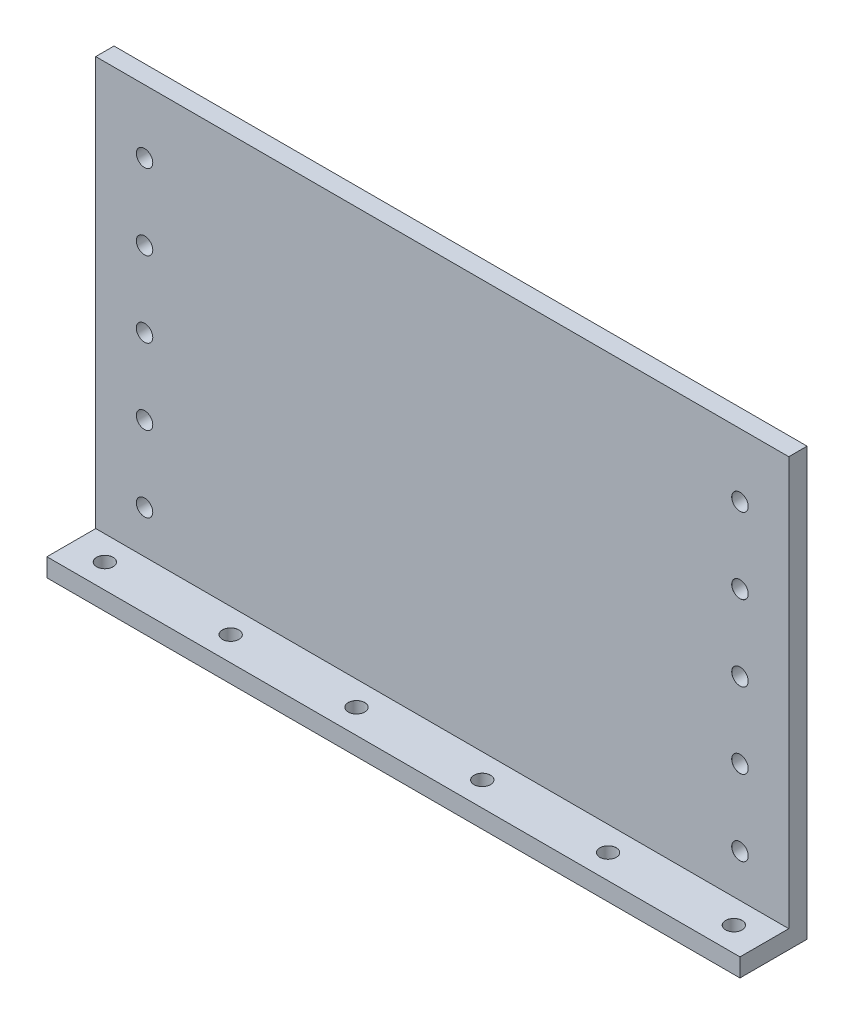
ISO-10303-21;
HEADER;
FILE_DESCRIPTION(('STEP AP214'),'2;1');
FILE_NAME('part.step','',(''),(''),'','','');
FILE_SCHEMA(('AUTOMOTIVE_DESIGN { 1 0 10303 214 1 1 1 1 }'));
ENDSEC;
DATA;
#1=APPLICATION_CONTEXT('core data for automotive mechanical design processes');
#2=APPLICATION_PROTOCOL_DEFINITION('international standard','automotive_design',2000,#1);
#3=PRODUCT_CONTEXT('',#1,'mechanical');
#4=PRODUCT('Part','Part','',(#3));
#5=PRODUCT_RELATED_PRODUCT_CATEGORY('part','',(#4));
#6=PRODUCT_DEFINITION_FORMATION('','',#4);
#7=PRODUCT_DEFINITION_CONTEXT('part definition',#1,'design');
#8=PRODUCT_DEFINITION('design','',#6,#7);
#9=PRODUCT_DEFINITION_SHAPE('','',#8);
#10=(LENGTH_UNIT() NAMED_UNIT(*) SI_UNIT(.MILLI.,.METRE.));
#11=(NAMED_UNIT(*) PLANE_ANGLE_UNIT() SI_UNIT($,.RADIAN.));
#12=(NAMED_UNIT(*) SI_UNIT($,.STERADIAN.) SOLID_ANGLE_UNIT());
#13=UNCERTAINTY_MEASURE_WITH_UNIT(LENGTH_MEASURE(1.E-05),#10,'distance_accuracy_value','');
#14=(GEOMETRIC_REPRESENTATION_CONTEXT(3) GLOBAL_UNCERTAINTY_ASSIGNED_CONTEXT((#13)) GLOBAL_UNIT_ASSIGNED_CONTEXT((#10,
#11,#12)) REPRESENTATION_CONTEXT('',''));
#15=CARTESIAN_POINT('',(0.,0.,0.));
#16=DIRECTION('',(0.,0.,1.));
#17=DIRECTION('',(1.,0.,0.));
#18=AXIS2_PLACEMENT_3D('',#15,#16,#17);
#19=CARTESIAN_POINT('',(-256.5,-160.,35.));
#20=DIRECTION('',(0.,1.,0.));
#21=DIRECTION('',(0.,0.,1.));
#22=AXIS2_PLACEMENT_3D('',#19,#20,#21);
#23=CONICAL_SURFACE('',#22,6.77499999999998,0.872664625996683);
#24=CARTESIAN_POINT('',(-256.5,-160.020977490779,35.));
#25=DIRECTION('',(0.,1.,0.));
#26=DIRECTION('',(0.,0.,1.));
#27=AXIS2_PLACEMENT_3D('',#24,#25,#26);
#28=CIRCLE('',#27,6.74999999999998);
#29=CARTESIAN_POINT('',(-256.5,-160.020977490779,41.75));
#30=VERTEX_POINT('',#29);
#31=EDGE_CURVE('E11',#30,#30,#28,.T.);
#32=ORIENTED_EDGE('',*,*,#31,.F.);
#33=EDGE_LOOP('',(#32));
#34=FACE_BOUND('',#33,.T.);
#35=CARTESIAN_POINT('',(-256.5,-160.,35.));
#36=DIRECTION('',(0.,1.,0.));
#37=DIRECTION('',(0.,0.,1.));
#38=AXIS2_PLACEMENT_3D('',#35,#36,#37);
#39=CIRCLE('',#38,6.77499999999998);
#40=CARTESIAN_POINT('',(-256.5,-160.,41.775));
#41=VERTEX_POINT('',#40);
#42=EDGE_CURVE('E197',#41,#41,#39,.T.);
#43=ORIENTED_EDGE('',*,*,#42,.T.);
#44=EDGE_LOOP('',(#43));
#45=FACE_BOUND('',#44,.T.);
#46=ADVANCED_FACE('F39',(#34,#45),#23,.F.);
#47=CARTESIAN_POINT('',(-256.5,-160.,35.));
#48=DIRECTION('',(0.,1.,0.));
#49=DIRECTION('',(0.,0.,1.));
#50=AXIS2_PLACEMENT_3D('',#47,#48,#49);
#51=CYLINDRICAL_SURFACE('',#50,6.74999999999998);
#52=CARTESIAN_POINT('',(-256.5,-175.,35.));
#53=DIRECTION('',(0.,1.,0.));
#54=DIRECTION('',(0.,0.,1.));
#55=AXIS2_PLACEMENT_3D('',#52,#53,#54);
#56=CIRCLE('',#55,6.74999999999998);
#57=CARTESIAN_POINT('',(-256.5,-175.,41.75));
#58=VERTEX_POINT('',#57);
#59=EDGE_CURVE('E46',#58,#58,#56,.T.);
#60=ORIENTED_EDGE('',*,*,#59,.F.);
#61=EDGE_LOOP('',(#60));
#62=FACE_BOUND('',#61,.T.);
#63=ORIENTED_EDGE('',*,*,#31,.T.);
#64=EDGE_LOOP('',(#63));
#65=FACE_BOUND('',#64,.T.);
#66=ADVANCED_FACE('F204',(#62,#65),#51,.F.);
#67=CARTESIAN_POINT('',(-153.4,-160.,35.));
#68=DIRECTION('',(0.,1.,0.));
#69=DIRECTION('',(0.,0.,1.));
#70=AXIS2_PLACEMENT_3D('',#67,#68,#69);
#71=CONICAL_SURFACE('',#70,6.77499999999998,0.872664625996683);
#72=CARTESIAN_POINT('',(-153.4,-160.020977490779,35.));
#73=DIRECTION('',(0.,1.,0.));
#74=DIRECTION('',(0.,0.,1.));
#75=AXIS2_PLACEMENT_3D('',#72,#73,#74);
#76=CIRCLE('',#75,6.74999999999998);
#77=CARTESIAN_POINT('',(-153.4,-160.020977490779,41.75));
#78=VERTEX_POINT('',#77);
#79=EDGE_CURVE('E194',#78,#78,#76,.T.);
#80=ORIENTED_EDGE('',*,*,#79,.F.);
#81=EDGE_LOOP('',(#80));
#82=FACE_BOUND('',#81,.T.);
#83=CARTESIAN_POINT('',(-153.4,-160.,35.));
#84=DIRECTION('',(0.,1.,0.));
#85=DIRECTION('',(0.,0.,1.));
#86=AXIS2_PLACEMENT_3D('',#83,#84,#85);
#87=CIRCLE('',#86,6.77499999999998);
#88=CARTESIAN_POINT('',(-153.4,-160.,41.775));
#89=VERTEX_POINT('',#88);
#90=EDGE_CURVE('E188',#89,#89,#87,.T.);
#91=ORIENTED_EDGE('',*,*,#90,.T.);
#92=EDGE_LOOP('',(#91));
#93=FACE_BOUND('',#92,.T.);
#94=ADVANCED_FACE('F207',(#82,#93),#71,.F.);
#95=CARTESIAN_POINT('',(-153.4,-160.,35.));
#96=DIRECTION('',(0.,1.,0.));
#97=DIRECTION('',(0.,0.,1.));
#98=AXIS2_PLACEMENT_3D('',#95,#96,#97);
#99=CYLINDRICAL_SURFACE('',#98,6.74999999999998);
#100=CARTESIAN_POINT('',(-153.4,-175.,35.));
#101=DIRECTION('',(0.,1.,0.));
#102=DIRECTION('',(0.,0.,1.));
#103=AXIS2_PLACEMENT_3D('',#100,#101,#102);
#104=CIRCLE('',#103,6.74999999999998);
#105=CARTESIAN_POINT('',(-153.4,-175.,41.75));
#106=VERTEX_POINT('',#105);
#107=EDGE_CURVE('E191',#106,#106,#104,.T.);
#108=ORIENTED_EDGE('',*,*,#107,.F.);
#109=EDGE_LOOP('',(#108));
#110=FACE_BOUND('',#109,.T.);
#111=ORIENTED_EDGE('',*,*,#79,.T.);
#112=EDGE_LOOP('',(#111));
#113=FACE_BOUND('',#112,.T.);
#114=ADVANCED_FACE('F287',(#110,#113),#99,.F.);
#115=CARTESIAN_POINT('',(-50.3,-160.,35.));
#116=DIRECTION('',(0.,1.,0.));
#117=DIRECTION('',(0.,0.,1.));
#118=AXIS2_PLACEMENT_3D('',#115,#116,#117);
#119=CONICAL_SURFACE('',#118,6.77499999999998,0.872664625996683);
#120=CARTESIAN_POINT('',(-50.3,-160.020977490779,35.));
#121=DIRECTION('',(0.,1.,0.));
#122=DIRECTION('',(0.,0.,1.));
#123=AXIS2_PLACEMENT_3D('',#120,#121,#122);
#124=CIRCLE('',#123,6.74999999999998);
#125=CARTESIAN_POINT('',(-50.3,-160.020977490779,41.75));
#126=VERTEX_POINT('',#125);
#127=EDGE_CURVE('E185',#126,#126,#124,.T.);
#128=ORIENTED_EDGE('',*,*,#127,.F.);
#129=EDGE_LOOP('',(#128));
#130=FACE_BOUND('',#129,.T.);
#131=CARTESIAN_POINT('',(-50.3,-160.,35.));
#132=DIRECTION('',(0.,1.,0.));
#133=DIRECTION('',(0.,0.,1.));
#134=AXIS2_PLACEMENT_3D('',#131,#132,#133);
#135=CIRCLE('',#134,6.77499999999998);
#136=CARTESIAN_POINT('',(-50.3,-160.,41.775));
#137=VERTEX_POINT('',#136);
#138=EDGE_CURVE('E179',#137,#137,#135,.T.);
#139=ORIENTED_EDGE('',*,*,#138,.T.);
#140=EDGE_LOOP('',(#139));
#141=FACE_BOUND('',#140,.T.);
#142=ADVANCED_FACE('F283',(#130,#141),#119,.F.);
#143=CARTESIAN_POINT('',(-50.3,-160.,35.));
#144=DIRECTION('',(0.,1.,0.));
#145=DIRECTION('',(0.,0.,1.));
#146=AXIS2_PLACEMENT_3D('',#143,#144,#145);
#147=CYLINDRICAL_SURFACE('',#146,6.74999999999998);
#148=CARTESIAN_POINT('',(-50.3,-175.,35.));
#149=DIRECTION('',(0.,1.,0.));
#150=DIRECTION('',(0.,0.,1.));
#151=AXIS2_PLACEMENT_3D('',#148,#149,#150);
#152=CIRCLE('',#151,6.74999999999998);
#153=CARTESIAN_POINT('',(-50.3,-175.,41.75));
#154=VERTEX_POINT('',#153);
#155=EDGE_CURVE('E182',#154,#154,#152,.T.);
#156=ORIENTED_EDGE('',*,*,#155,.F.);
#157=EDGE_LOOP('',(#156));
#158=FACE_BOUND('',#157,.T.);
#159=ORIENTED_EDGE('',*,*,#127,.T.);
#160=EDGE_LOOP('',(#159));
#161=FACE_BOUND('',#160,.T.);
#162=ADVANCED_FACE('F279',(#158,#161),#147,.F.);
#163=CARTESIAN_POINT('',(52.8000000000001,-160.,35.));
#164=DIRECTION('',(0.,1.,0.));
#165=DIRECTION('',(0.,0.,1.));
#166=AXIS2_PLACEMENT_3D('',#163,#164,#165);
#167=CONICAL_SURFACE('',#166,6.77499999999998,0.872664625996683);
#168=CARTESIAN_POINT('',(52.8000000000001,-160.020977490779,35.));
#169=DIRECTION('',(0.,1.,0.));
#170=DIRECTION('',(0.,0.,1.));
#171=AXIS2_PLACEMENT_3D('',#168,#169,#170);
#172=CIRCLE('',#171,6.74999999999998);
#173=CARTESIAN_POINT('',(52.8000000000001,-160.020977490779,41.75));
#174=VERTEX_POINT('',#173);
#175=EDGE_CURVE('E176',#174,#174,#172,.T.);
#176=ORIENTED_EDGE('',*,*,#175,.F.);
#177=EDGE_LOOP('',(#176));
#178=FACE_BOUND('',#177,.T.);
#179=CARTESIAN_POINT('',(52.8000000000001,-160.,35.));
#180=DIRECTION('',(0.,1.,0.));
#181=DIRECTION('',(0.,0.,1.));
#182=AXIS2_PLACEMENT_3D('',#179,#180,#181);
#183=CIRCLE('',#182,6.77499999999998);
#184=CARTESIAN_POINT('',(52.8000000000001,-160.,41.775));
#185=VERTEX_POINT('',#184);
#186=EDGE_CURVE('E145',#185,#185,#183,.T.);
#187=ORIENTED_EDGE('',*,*,#186,.T.);
#188=EDGE_LOOP('',(#187));
#189=FACE_BOUND('',#188,.T.);
#190=ADVANCED_FACE('F275',(#178,#189),#167,.F.);
#191=CARTESIAN_POINT('',(52.8000000000001,-160.,35.));
#192=DIRECTION('',(0.,1.,0.));
#193=DIRECTION('',(0.,0.,1.));
#194=AXIS2_PLACEMENT_3D('',#191,#192,#193);
#195=CYLINDRICAL_SURFACE('',#194,6.74999999999998);
#196=CARTESIAN_POINT('',(52.8000000000001,-175.,35.));
#197=DIRECTION('',(0.,1.,0.));
#198=DIRECTION('',(0.,0.,1.));
#199=AXIS2_PLACEMENT_3D('',#196,#197,#198);
#200=CIRCLE('',#199,6.74999999999998);
#201=CARTESIAN_POINT('',(52.8000000000001,-175.,41.75));
#202=VERTEX_POINT('',#201);
#203=EDGE_CURVE('E173',#202,#202,#200,.T.);
#204=ORIENTED_EDGE('',*,*,#203,.F.);
#205=EDGE_LOOP('',(#204));
#206=FACE_BOUND('',#205,.T.);
#207=ORIENTED_EDGE('',*,*,#175,.T.);
#208=EDGE_LOOP('',(#207));
#209=FACE_BOUND('',#208,.T.);
#210=ADVANCED_FACE('F271',(#206,#209),#195,.F.);
#211=CARTESIAN_POINT('',(244.,-125.,15.));
#212=DIRECTION('',(0.,0.,1.));
#213=DIRECTION('',(1.,0.,0.));
#214=AXIS2_PLACEMENT_3D('',#211,#212,#213);
#215=CONICAL_SURFACE('',#214,6.775,0.872664625996683);
#216=CARTESIAN_POINT('',(244.,-125.,14.9790225092205));
#217=DIRECTION('',(0.,0.,1.));
#218=DIRECTION('',(1.,0.,0.));
#219=AXIS2_PLACEMENT_3D('',#216,#217,#218);
#220=CIRCLE('',#219,6.75000000000001);
#221=CARTESIAN_POINT('',(250.75,-125.,14.9790225092205));
#222=VERTEX_POINT('',#221);
#223=EDGE_CURVE('E142',#222,#222,#220,.T.);
#224=ORIENTED_EDGE('',*,*,#223,.F.);
#225=EDGE_LOOP('',(#224));
#226=FACE_BOUND('',#225,.T.);
#227=CARTESIAN_POINT('',(244.,-125.,15.));
#228=DIRECTION('',(0.,0.,1.));
#229=DIRECTION('',(1.,0.,0.));
#230=AXIS2_PLACEMENT_3D('',#227,#228,#229);
#231=CIRCLE('',#230,6.775);
#232=CARTESIAN_POINT('',(250.775,-125.,15.));
#233=VERTEX_POINT('',#232);
#234=EDGE_CURVE('E136',#233,#233,#231,.T.);
#235=ORIENTED_EDGE('',*,*,#234,.T.);
#236=EDGE_LOOP('',(#235));
#237=FACE_BOUND('',#236,.T.);
#238=ADVANCED_FACE('F267',(#226,#237),#215,.F.);
#239=CARTESIAN_POINT('',(244.,-125.,15.));
#240=DIRECTION('',(0.,0.,1.));
#241=DIRECTION('',(1.,0.,0.));
#242=AXIS2_PLACEMENT_3D('',#239,#240,#241);
#243=CYLINDRICAL_SURFACE('',#242,6.75000000000001);
#244=CARTESIAN_POINT('',(244.,-125.,0.));
#245=DIRECTION('',(0.,0.,1.));
#246=DIRECTION('',(1.,0.,0.));
#247=AXIS2_PLACEMENT_3D('',#244,#245,#246);
#248=CIRCLE('',#247,6.75000000000001);
#249=CARTESIAN_POINT('',(250.75,-125.,0.));
#250=VERTEX_POINT('',#249);
#251=EDGE_CURVE('E139',#250,#250,#248,.T.);
#252=ORIENTED_EDGE('',*,*,#251,.F.);
#253=EDGE_LOOP('',(#252));
#254=FACE_BOUND('',#253,.T.);
#255=ORIENTED_EDGE('',*,*,#223,.T.);
#256=EDGE_LOOP('',(#255));
#257=FACE_BOUND('',#256,.T.);
#258=ADVANCED_FACE('F263',(#254,#257),#243,.F.);
#259=CARTESIAN_POINT('',(244.,-62.9999999999999,15.));
#260=DIRECTION('',(0.,0.,1.));
#261=DIRECTION('',(1.,0.,0.));
#262=AXIS2_PLACEMENT_3D('',#259,#260,#261);
#263=CONICAL_SURFACE('',#262,6.775,0.872664625996683);
#264=CARTESIAN_POINT('',(244.,-62.9999999999999,14.9790225092205));
#265=DIRECTION('',(0.,0.,1.));
#266=DIRECTION('',(1.,0.,0.));
#267=AXIS2_PLACEMENT_3D('',#264,#265,#266);
#268=CIRCLE('',#267,6.75000000000001);
#269=CARTESIAN_POINT('',(250.75,-62.9999999999999,14.9790225092205));
#270=VERTEX_POINT('',#269);
#271=EDGE_CURVE('E133',#270,#270,#268,.T.);
#272=ORIENTED_EDGE('',*,*,#271,.F.);
#273=EDGE_LOOP('',(#272));
#274=FACE_BOUND('',#273,.T.);
#275=CARTESIAN_POINT('',(244.,-62.9999999999999,15.));
#276=DIRECTION('',(0.,0.,1.));
#277=DIRECTION('',(1.,0.,0.));
#278=AXIS2_PLACEMENT_3D('',#275,#276,#277);
#279=CIRCLE('',#278,6.775);
#280=CARTESIAN_POINT('',(250.775,-62.9999999999999,15.));
#281=VERTEX_POINT('',#280);
#282=EDGE_CURVE('E127',#281,#281,#279,.T.);
#283=ORIENTED_EDGE('',*,*,#282,.T.);
#284=EDGE_LOOP('',(#283));
#285=FACE_BOUND('',#284,.T.);
#286=ADVANCED_FACE('F259',(#274,#285),#263,.F.);
#287=CARTESIAN_POINT('',(244.,-62.9999999999999,15.));
#288=DIRECTION('',(0.,0.,1.));
#289=DIRECTION('',(1.,0.,0.));
#290=AXIS2_PLACEMENT_3D('',#287,#288,#289);
#291=CYLINDRICAL_SURFACE('',#290,6.75000000000001);
#292=CARTESIAN_POINT('',(244.,-62.9999999999999,0.));
#293=DIRECTION('',(0.,0.,1.));
#294=DIRECTION('',(1.,0.,0.));
#295=AXIS2_PLACEMENT_3D('',#292,#293,#294);
#296=CIRCLE('',#295,6.75000000000001);
#297=CARTESIAN_POINT('',(250.75,-62.9999999999999,0.));
#298=VERTEX_POINT('',#297);
#299=EDGE_CURVE('E130',#298,#298,#296,.T.);
#300=ORIENTED_EDGE('',*,*,#299,.F.);
#301=EDGE_LOOP('',(#300));
#302=FACE_BOUND('',#301,.T.);
#303=ORIENTED_EDGE('',*,*,#271,.T.);
#304=EDGE_LOOP('',(#303));
#305=FACE_BOUND('',#304,.T.);
#306=ADVANCED_FACE('F255',(#302,#305),#291,.F.);
#307=CARTESIAN_POINT('',(244.,-0.999999999999945,15.));
#308=DIRECTION('',(0.,0.,1.));
#309=DIRECTION('',(1.,0.,0.));
#310=AXIS2_PLACEMENT_3D('',#307,#308,#309);
#311=CONICAL_SURFACE('',#310,6.775,0.872664625996683);
#312=CARTESIAN_POINT('',(244.,-0.999999999999945,14.9790225092205));
#313=DIRECTION('',(0.,0.,1.));
#314=DIRECTION('',(1.,0.,0.));
#315=AXIS2_PLACEMENT_3D('',#312,#313,#314);
#316=CIRCLE('',#315,6.75000000000001);
#317=CARTESIAN_POINT('',(250.75,-0.999999999999945,14.9790225092205));
#318=VERTEX_POINT('',#317);
#319=EDGE_CURVE('E124',#318,#318,#316,.T.);
#320=ORIENTED_EDGE('',*,*,#319,.F.);
#321=EDGE_LOOP('',(#320));
#322=FACE_BOUND('',#321,.T.);
#323=CARTESIAN_POINT('',(244.,-0.999999999999945,15.));
#324=DIRECTION('',(0.,0.,1.));
#325=DIRECTION('',(1.,0.,0.));
#326=AXIS2_PLACEMENT_3D('',#323,#324,#325);
#327=CIRCLE('',#326,6.775);
#328=CARTESIAN_POINT('',(250.775,-0.999999999999945,15.));
#329=VERTEX_POINT('',#328);
#330=EDGE_CURVE('E118',#329,#329,#327,.T.);
#331=ORIENTED_EDGE('',*,*,#330,.T.);
#332=EDGE_LOOP('',(#331));
#333=FACE_BOUND('',#332,.T.);
#334=ADVANCED_FACE('F251',(#322,#333),#311,.F.);
#335=CARTESIAN_POINT('',(244.,-0.999999999999945,15.));
#336=DIRECTION('',(0.,0.,1.));
#337=DIRECTION('',(1.,0.,0.));
#338=AXIS2_PLACEMENT_3D('',#335,#336,#337);
#339=CYLINDRICAL_SURFACE('',#338,6.75000000000001);
#340=CARTESIAN_POINT('',(244.,-0.999999999999945,0.));
#341=DIRECTION('',(0.,0.,1.));
#342=DIRECTION('',(1.,0.,0.));
#343=AXIS2_PLACEMENT_3D('',#340,#341,#342);
#344=CIRCLE('',#343,6.75000000000001);
#345=CARTESIAN_POINT('',(250.75,-0.999999999999945,0.));
#346=VERTEX_POINT('',#345);
#347=EDGE_CURVE('E121',#346,#346,#344,.T.);
#348=ORIENTED_EDGE('',*,*,#347,.F.);
#349=EDGE_LOOP('',(#348));
#350=FACE_BOUND('',#349,.T.);
#351=ORIENTED_EDGE('',*,*,#319,.T.);
#352=EDGE_LOOP('',(#351));
#353=FACE_BOUND('',#352,.T.);
#354=ADVANCED_FACE('F248',(#350,#353),#339,.F.);
#355=CARTESIAN_POINT('',(-284.,-175.,15.));
#356=DIRECTION('',(1.,0.,0.));
#357=DIRECTION('',(0.,0.,-1.));
#358=AXIS2_PLACEMENT_3D('',#355,#356,#357);
#359=PLANE('',#358);
#360=DIRECTION('',(0.,-1.,0.));
#361=VECTOR('',#360,1.);
#362=CARTESIAN_POINT('',(-284.,-175.,0.));
#363=LINE('',#362,#361);
#364=CARTESIAN_POINT('',(-284.,175.,0.));
#365=VERTEX_POINT('',#364);
#366=CARTESIAN_POINT('',(-284.,-175.,0.));
#367=VERTEX_POINT('',#366);
#368=EDGE_CURVE('E95',#365,#367,#363,.T.);
#369=ORIENTED_EDGE('',*,*,#368,.T.);
#370=DIRECTION('',(0.,0.,-1.));
#371=VECTOR('',#370,1.);
#372=CARTESIAN_POINT('',(-284.,-175.,15.));
#373=LINE('',#372,#371);
#374=CARTESIAN_POINT('',(-284.,-175.,55.));
#375=VERTEX_POINT('',#374);
#376=EDGE_CURVE('E116',#375,#367,#373,.T.);
#377=ORIENTED_EDGE('',*,*,#376,.F.);
#378=DIRECTION('',(0.,-1.,0.));
#379=VECTOR('',#378,1.);
#380=CARTESIAN_POINT('',(-284.,-175.,55.));
#381=LINE('',#380,#379);
#382=CARTESIAN_POINT('',(-284.,-160.,55.));
#383=VERTEX_POINT('',#382);
#384=EDGE_CURVE('E655',#383,#375,#381,.T.);
#385=ORIENTED_EDGE('',*,*,#384,.F.);
#386=DIRECTION('',(0.,0.,-1.));
#387=VECTOR('',#386,1.);
#388=CARTESIAN_POINT('',(-284.,-160.,55.));
#389=LINE('',#388,#387);
#390=CARTESIAN_POINT('',(-284.,-160.,15.));
#391=VERTEX_POINT('',#390);
#392=EDGE_CURVE('E106',#383,#391,#389,.T.);
#393=ORIENTED_EDGE('',*,*,#392,.T.);
#394=DIRECTION('',(0.,-1.,0.));
#395=VECTOR('',#394,1.);
#396=CARTESIAN_POINT('',(-284.,-175.,15.));
#397=LINE('',#396,#395);
#398=CARTESIAN_POINT('',(-284.,175.,15.));
#399=VERTEX_POINT('',#398);
#400=EDGE_CURVE('E88',#399,#391,#397,.T.);
#401=ORIENTED_EDGE('',*,*,#400,.F.);
#402=DIRECTION('',(0.,0.,-1.));
#403=VECTOR('',#402,1.);
#404=CARTESIAN_POINT('',(-284.,175.,15.));
#405=LINE('',#404,#403);
#406=EDGE_CURVE('E81',#399,#365,#405,.T.);
#407=ORIENTED_EDGE('',*,*,#406,.T.);
#408=EDGE_LOOP('',(#369,#377,#385,#393,#401,#407));
#409=FACE_BOUND('',#408,.T.);
#410=ADVANCED_FACE('F93',(#409),#359,.F.);
#411=CARTESIAN_POINT('',(284.,-175.,15.));
#412=DIRECTION('',(0.,1.,0.));
#413=DIRECTION('',(-1.,0.,0.));
#414=AXIS2_PLACEMENT_3D('',#411,#412,#413);
#415=PLANE('',#414);
#416=CARTESIAN_POINT('',(155.9,-175.,35.));
#417=DIRECTION('',(0.,1.,0.));
#418=DIRECTION('',(0.,0.,1.));
#419=AXIS2_PLACEMENT_3D('',#416,#417,#418);
#420=CIRCLE('',#419,6.74999999999998);
#421=CARTESIAN_POINT('',(155.9,-175.,41.75));
#422=VERTEX_POINT('',#421);
#423=EDGE_CURVE('E599',#422,#422,#420,.T.);
#424=ORIENTED_EDGE('',*,*,#423,.T.);
#425=EDGE_LOOP('',(#424));
#426=FACE_BOUND('',#425,.T.);
#427=CARTESIAN_POINT('',(259.,-175.,35.));
#428=DIRECTION('',(0.,1.,0.));
#429=DIRECTION('',(0.,0.,1.));
#430=AXIS2_PLACEMENT_3D('',#427,#428,#429);
#431=CIRCLE('',#430,6.74999999999998);
#432=CARTESIAN_POINT('',(259.,-175.,41.75));
#433=VERTEX_POINT('',#432);
#434=EDGE_CURVE('E614',#433,#433,#431,.T.);
#435=ORIENTED_EDGE('',*,*,#434,.T.);
#436=EDGE_LOOP('',(#435));
#437=FACE_BOUND('',#436,.T.);
#438=DIRECTION('',(1.,0.,0.));
#439=VECTOR('',#438,1.);
#440=CARTESIAN_POINT('',(284.,-175.,0.));
#441=LINE('',#440,#439);
#442=CARTESIAN_POINT('',(284.,-175.,0.));
#443=VERTEX_POINT('',#442);
#444=EDGE_CURVE('E100',#367,#443,#441,.T.);
#445=ORIENTED_EDGE('',*,*,#444,.T.);
#446=DIRECTION('',(0.,0.,-1.));
#447=VECTOR('',#446,1.);
#448=CARTESIAN_POINT('',(284.,-175.,15.));
#449=LINE('',#448,#447);
#450=CARTESIAN_POINT('',(284.,-175.,55.));
#451=VERTEX_POINT('',#450);
#452=EDGE_CURVE('E113',#451,#443,#449,.T.);
#453=ORIENTED_EDGE('',*,*,#452,.F.);
#454=DIRECTION('',(1.,0.,0.));
#455=VECTOR('',#454,1.);
#456=CARTESIAN_POINT('',(-284.,-175.,55.));
#457=LINE('',#456,#455);
#458=EDGE_CURVE('E658',#375,#451,#457,.T.);
#459=ORIENTED_EDGE('',*,*,#458,.F.);
#460=ORIENTED_EDGE('',*,*,#376,.T.);
#461=EDGE_LOOP('',(#445,#453,#459,#460));
#462=FACE_BOUND('',#461,.T.);
#463=ORIENTED_EDGE('',*,*,#203,.T.);
#464=EDGE_LOOP('',(#463));
#465=FACE_BOUND('',#464,.T.);
#466=ORIENTED_EDGE('',*,*,#155,.T.);
#467=EDGE_LOOP('',(#466));
#468=FACE_BOUND('',#467,.T.);
#469=ORIENTED_EDGE('',*,*,#107,.T.);
#470=EDGE_LOOP('',(#469));
#471=FACE_BOUND('',#470,.T.);
#472=ORIENTED_EDGE('',*,*,#59,.T.);
#473=EDGE_LOOP('',(#472));
#474=FACE_BOUND('',#473,.T.);
#475=ADVANCED_FACE('F202',(#426,#437,#462,#465,#468,#471,#474),#415,.F.);
#476=CARTESIAN_POINT('',(284.,-175.,15.));
#477=DIRECTION('',(-1.,0.,0.));
#478=DIRECTION('',(0.,0.,1.));
#479=AXIS2_PLACEMENT_3D('',#476,#477,#478);
#480=PLANE('',#479);
#481=DIRECTION('',(0.,1.,0.));
#482=VECTOR('',#481,1.);
#483=CARTESIAN_POINT('',(284.,-175.,0.));
#484=LINE('',#483,#482);
#485=CARTESIAN_POINT('',(284.,175.,0.));
#486=VERTEX_POINT('',#485);
#487=EDGE_CURVE('E89',#443,#486,#484,.T.);
#488=ORIENTED_EDGE('',*,*,#487,.T.);
#489=DIRECTION('',(0.,0.,-1.));
#490=VECTOR('',#489,1.);
#491=CARTESIAN_POINT('',(284.,175.,15.));
#492=LINE('',#491,#490);
#493=CARTESIAN_POINT('',(284.,175.,15.));
#494=VERTEX_POINT('',#493);
#495=EDGE_CURVE('E84',#494,#486,#492,.T.);
#496=ORIENTED_EDGE('',*,*,#495,.F.);
#497=DIRECTION('',(0.,1.,0.));
#498=VECTOR('',#497,1.);
#499=CARTESIAN_POINT('',(284.,-175.,15.));
#500=LINE('',#499,#498);
#501=CARTESIAN_POINT('',(284.,-160.,15.));
#502=VERTEX_POINT('',#501);
#503=EDGE_CURVE('E669',#502,#494,#500,.T.);
#504=ORIENTED_EDGE('',*,*,#503,.F.);
#505=DIRECTION('',(0.,0.,-1.));
#506=VECTOR('',#505,1.);
#507=CARTESIAN_POINT('',(284.,-160.,55.));
#508=LINE('',#507,#506);
#509=CARTESIAN_POINT('',(284.,-160.,55.));
#510=VERTEX_POINT('',#509);
#511=EDGE_CURVE('E102',#510,#502,#508,.T.);
#512=ORIENTED_EDGE('',*,*,#511,.F.);
#513=DIRECTION('',(0.,1.,0.));
#514=VECTOR('',#513,1.);
#515=CARTESIAN_POINT('',(284.,-175.,55.));
#516=LINE('',#515,#514);
#517=EDGE_CURVE('E661',#451,#510,#516,.T.);
#518=ORIENTED_EDGE('',*,*,#517,.F.);
#519=ORIENTED_EDGE('',*,*,#452,.T.);
#520=EDGE_LOOP('',(#488,#496,#504,#512,#518,#519));
#521=FACE_BOUND('',#520,.T.);
#522=ADVANCED_FACE('F240',(#521),#480,.F.);
#523=CARTESIAN_POINT('',(284.,175.,15.));
#524=DIRECTION('',(0.,-1.,0.));
#525=DIRECTION('',(1.,0.,0.));
#526=AXIS2_PLACEMENT_3D('',#523,#524,#525);
#527=PLANE('',#526);
#528=DIRECTION('',(-1.,0.,0.));
#529=VECTOR('',#528,1.);
#530=CARTESIAN_POINT('',(284.,175.,0.));
#531=LINE('',#530,#529);
#532=EDGE_CURVE('E78',#486,#365,#531,.T.);
#533=ORIENTED_EDGE('',*,*,#532,.T.);
#534=ORIENTED_EDGE('',*,*,#406,.F.);
#535=DIRECTION('',(-1.,0.,0.));
#536=VECTOR('',#535,1.);
#537=CARTESIAN_POINT('',(284.,175.,15.));
#538=LINE('',#537,#536);
#539=EDGE_CURVE('E59',#494,#399,#538,.T.);
#540=ORIENTED_EDGE('',*,*,#539,.F.);
#541=ORIENTED_EDGE('',*,*,#495,.T.);
#542=EDGE_LOOP('',(#533,#534,#540,#541));
#543=FACE_BOUND('',#542,.T.);
#544=ADVANCED_FACE('F80',(#543),#527,.F.);
#545=CARTESIAN_POINT('',(0.,0.,15.));
#546=DIRECTION('',(0.,0.,1.));
#547=DIRECTION('',(1.,0.,0.));
#548=AXIS2_PLACEMENT_3D('',#545,#546,#547);
#549=PLANE('',#548);
#550=CARTESIAN_POINT('',(-244.,-125.,15.));
#551=DIRECTION('',(0.,0.,1.));
#552=DIRECTION('',(1.,0.,0.));
#553=AXIS2_PLACEMENT_3D('',#550,#551,#552);
#554=CIRCLE('',#553,6.74999999999999);
#555=CARTESIAN_POINT('',(-237.25,-125.,15.));
#556=VERTEX_POINT('',#555);
#557=EDGE_CURVE('E166',#556,#556,#554,.T.);
#558=ORIENTED_EDGE('',*,*,#557,.F.);
#559=EDGE_LOOP('',(#558));
#560=FACE_BOUND('',#559,.T.);
#561=CARTESIAN_POINT('',(-244.,-62.9999999999999,15.));
#562=DIRECTION('',(0.,0.,1.));
#563=DIRECTION('',(1.,0.,0.));
#564=AXIS2_PLACEMENT_3D('',#561,#562,#563);
#565=CIRCLE('',#564,6.74999999999999);
#566=CARTESIAN_POINT('',(-237.25,-62.9999999999999,15.));
#567=VERTEX_POINT('',#566);
#568=EDGE_CURVE('E161',#567,#567,#565,.T.);
#569=ORIENTED_EDGE('',*,*,#568,.F.);
#570=EDGE_LOOP('',(#569));
#571=FACE_BOUND('',#570,.T.);
#572=CARTESIAN_POINT('',(-244.,-0.999999999999945,15.));
#573=DIRECTION('',(0.,0.,1.));
#574=DIRECTION('',(1.,0.,0.));
#575=AXIS2_PLACEMENT_3D('',#572,#573,#574);
#576=CIRCLE('',#575,6.74999999999999);
#577=CARTESIAN_POINT('',(-237.25,-0.999999999999945,15.));
#578=VERTEX_POINT('',#577);
#579=EDGE_CURVE('E156',#578,#578,#576,.T.);
#580=ORIENTED_EDGE('',*,*,#579,.F.);
#581=EDGE_LOOP('',(#580));
#582=FACE_BOUND('',#581,.T.);
#583=CARTESIAN_POINT('',(-244.,61.0000000000001,15.));
#584=DIRECTION('',(0.,0.,1.));
#585=DIRECTION('',(1.,0.,0.));
#586=AXIS2_PLACEMENT_3D('',#583,#584,#585);
#587=CIRCLE('',#586,6.74999999999999);
#588=CARTESIAN_POINT('',(-237.25,61.0000000000001,15.));
#589=VERTEX_POINT('',#588);
#590=EDGE_CURVE('E151',#589,#589,#587,.T.);
#591=ORIENTED_EDGE('',*,*,#590,.F.);
#592=EDGE_LOOP('',(#591));
#593=FACE_BOUND('',#592,.T.);
#594=CARTESIAN_POINT('',(-244.,123.,15.));
#595=DIRECTION('',(0.,0.,1.));
#596=DIRECTION('',(1.,0.,0.));
#597=AXIS2_PLACEMENT_3D('',#594,#595,#596);
#598=CIRCLE('',#597,6.74999999999999);
#599=CARTESIAN_POINT('',(-237.25,123.,15.));
#600=VERTEX_POINT('',#599);
#601=EDGE_CURVE('E146',#600,#600,#598,.T.);
#602=ORIENTED_EDGE('',*,*,#601,.F.);
#603=EDGE_LOOP('',(#602));
#604=FACE_BOUND('',#603,.T.);
#605=CARTESIAN_POINT('',(244.,61.0000000000001,15.));
#606=DIRECTION('',(0.,0.,1.));
#607=DIRECTION('',(1.,0.,0.));
#608=AXIS2_PLACEMENT_3D('',#605,#606,#607);
#609=CIRCLE('',#608,6.775);
#610=CARTESIAN_POINT('',(250.775,61.0000000000001,15.));
#611=VERTEX_POINT('',#610);
#612=EDGE_CURVE('E149',#611,#611,#609,.T.);
#613=ORIENTED_EDGE('',*,*,#612,.F.);
#614=EDGE_LOOP('',(#613));
#615=FACE_BOUND('',#614,.T.);
#616=CARTESIAN_POINT('',(244.,123.,15.));
#617=DIRECTION('',(0.,0.,1.));
#618=DIRECTION('',(1.,0.,0.));
#619=AXIS2_PLACEMENT_3D('',#616,#617,#618);
#620=CIRCLE('',#619,6.775);
#621=CARTESIAN_POINT('',(250.775,123.,15.));
#622=VERTEX_POINT('',#621);
#623=EDGE_CURVE('E646',#622,#622,#620,.T.);
#624=ORIENTED_EDGE('',*,*,#623,.F.);
#625=EDGE_LOOP('',(#624));
#626=FACE_BOUND('',#625,.T.);
#627=DIRECTION('',(-1.,0.,0.));
#628=VECTOR('',#627,1.);
#629=CARTESIAN_POINT('',(-284.,-160.,15.));
#630=LINE('',#629,#628);
#631=EDGE_CURVE('E53',#502,#391,#630,.T.);
#632=ORIENTED_EDGE('',*,*,#631,.F.);
#633=ORIENTED_EDGE('',*,*,#503,.T.);
#634=ORIENTED_EDGE('',*,*,#539,.T.);
#635=ORIENTED_EDGE('',*,*,#400,.T.);
#636=EDGE_LOOP('',(#632,#633,#634,#635));
#637=FACE_BOUND('',#636,.T.);
#638=ORIENTED_EDGE('',*,*,#330,.F.);
#639=EDGE_LOOP('',(#638));
#640=FACE_BOUND('',#639,.T.);
#641=ORIENTED_EDGE('',*,*,#282,.F.);
#642=EDGE_LOOP('',(#641));
#643=FACE_BOUND('',#642,.T.);
#644=ORIENTED_EDGE('',*,*,#234,.F.);
#645=EDGE_LOOP('',(#644));
#646=FACE_BOUND('',#645,.T.);
#647=ADVANCED_FACE('F228',(#560,#571,#582,#593,#604,#615,#626,#637,#640,#643,#646),#549,.T.);
#648=CARTESIAN_POINT('',(0.,0.,0.));
#649=DIRECTION('',(0.,0.,1.));
#650=DIRECTION('',(1.,0.,0.));
#651=AXIS2_PLACEMENT_3D('',#648,#649,#650);
#652=PLANE('',#651);
#653=CARTESIAN_POINT('',(-244.,-125.,0.));
#654=DIRECTION('',(0.,0.,-1.));
#655=DIRECTION('',(-1.,0.,0.));
#656=AXIS2_PLACEMENT_3D('',#653,#654,#655);
#657=CIRCLE('',#656,6.775);
#658=CARTESIAN_POINT('',(-250.775,-125.,0.));
#659=VERTEX_POINT('',#658);
#660=EDGE_CURVE('E617',#659,#659,#657,.T.);
#661=ORIENTED_EDGE('',*,*,#660,.F.);
#662=EDGE_LOOP('',(#661));
#663=FACE_BOUND('',#662,.T.);
#664=CARTESIAN_POINT('',(-244.,-62.9999999999999,0.));
#665=DIRECTION('',(0.,0.,-1.));
#666=DIRECTION('',(-1.,0.,0.));
#667=AXIS2_PLACEMENT_3D('',#664,#665,#666);
#668=CIRCLE('',#667,6.775);
#669=CARTESIAN_POINT('',(-250.775,-62.9999999999999,0.));
#670=VERTEX_POINT('',#669);
#671=EDGE_CURVE('E169',#670,#670,#668,.T.);
#672=ORIENTED_EDGE('',*,*,#671,.F.);
#673=EDGE_LOOP('',(#672));
#674=FACE_BOUND('',#673,.T.);
#675=CARTESIAN_POINT('',(-244.,-0.999999999999945,0.));
#676=DIRECTION('',(0.,0.,-1.));
#677=DIRECTION('',(-1.,0.,0.));
#678=AXIS2_PLACEMENT_3D('',#675,#676,#677);
#679=CIRCLE('',#678,6.775);
#680=CARTESIAN_POINT('',(-250.775,-0.999999999999945,0.));
#681=VERTEX_POINT('',#680);
#682=EDGE_CURVE('E164',#681,#681,#679,.T.);
#683=ORIENTED_EDGE('',*,*,#682,.F.);
#684=EDGE_LOOP('',(#683));
#685=FACE_BOUND('',#684,.T.);
#686=CARTESIAN_POINT('',(-244.,61.0000000000001,0.));
#687=DIRECTION('',(0.,0.,-1.));
#688=DIRECTION('',(-1.,0.,0.));
#689=AXIS2_PLACEMENT_3D('',#686,#687,#688);
#690=CIRCLE('',#689,6.775);
#691=CARTESIAN_POINT('',(-250.775,61.0000000000001,0.));
#692=VERTEX_POINT('',#691);
#693=EDGE_CURVE('E159',#692,#692,#690,.T.);
#694=ORIENTED_EDGE('',*,*,#693,.F.);
#695=EDGE_LOOP('',(#694));
#696=FACE_BOUND('',#695,.T.);
#697=CARTESIAN_POINT('',(-244.,123.,0.));
#698=DIRECTION('',(0.,0.,-1.));
#699=DIRECTION('',(-1.,0.,0.));
#700=AXIS2_PLACEMENT_3D('',#697,#698,#699);
#701=CIRCLE('',#700,6.775);
#702=CARTESIAN_POINT('',(-250.775,123.,0.));
#703=VERTEX_POINT('',#702);
#704=EDGE_CURVE('E154',#703,#703,#701,.T.);
#705=ORIENTED_EDGE('',*,*,#704,.F.);
#706=EDGE_LOOP('',(#705));
#707=FACE_BOUND('',#706,.T.);
#708=CARTESIAN_POINT('',(244.,61.0000000000001,0.));
#709=DIRECTION('',(0.,0.,1.));
#710=DIRECTION('',(1.,0.,0.));
#711=AXIS2_PLACEMENT_3D('',#708,#709,#710);
#712=CIRCLE('',#711,6.75000000000001);
#713=CARTESIAN_POINT('',(250.75,61.0000000000001,0.));
#714=VERTEX_POINT('',#713);
#715=EDGE_CURVE('E640',#714,#714,#712,.T.);
#716=ORIENTED_EDGE('',*,*,#715,.T.);
#717=EDGE_LOOP('',(#716));
#718=FACE_BOUND('',#717,.T.);
#719=CARTESIAN_POINT('',(244.,123.,0.));
#720=DIRECTION('',(0.,0.,1.));
#721=DIRECTION('',(1.,0.,0.));
#722=AXIS2_PLACEMENT_3D('',#719,#720,#721);
#723=CIRCLE('',#722,6.75000000000001);
#724=CARTESIAN_POINT('',(250.75,123.,0.));
#725=VERTEX_POINT('',#724);
#726=EDGE_CURVE('E652',#725,#725,#723,.T.);
#727=ORIENTED_EDGE('',*,*,#726,.T.);
#728=EDGE_LOOP('',(#727));
#729=FACE_BOUND('',#728,.T.);
#730=ORIENTED_EDGE('',*,*,#368,.F.);
#731=ORIENTED_EDGE('',*,*,#532,.F.);
#732=ORIENTED_EDGE('',*,*,#487,.F.);
#733=ORIENTED_EDGE('',*,*,#444,.F.);
#734=EDGE_LOOP('',(#730,#731,#732,#733));
#735=FACE_BOUND('',#734,.T.);
#736=ORIENTED_EDGE('',*,*,#347,.T.);
#737=EDGE_LOOP('',(#736));
#738=FACE_BOUND('',#737,.T.);
#739=ORIENTED_EDGE('',*,*,#299,.T.);
#740=EDGE_LOOP('',(#739));
#741=FACE_BOUND('',#740,.T.);
#742=ORIENTED_EDGE('',*,*,#251,.T.);
#743=EDGE_LOOP('',(#742));
#744=FACE_BOUND('',#743,.T.);
#745=ADVANCED_FACE('F98',(#663,#674,#685,#696,#707,#718,#729,#735,#738,#741,#744),#652,.F.);
#746=CARTESIAN_POINT('',(-284.,-160.,55.));
#747=DIRECTION('',(0.,-1.,0.));
#748=DIRECTION('',(0.,0.,-1.));
#749=AXIS2_PLACEMENT_3D('',#746,#747,#748);
#750=PLANE('',#749);
#751=CARTESIAN_POINT('',(155.9,-160.,35.));
#752=DIRECTION('',(0.,1.,0.));
#753=DIRECTION('',(0.,0.,1.));
#754=AXIS2_PLACEMENT_3D('',#751,#752,#753);
#755=CIRCLE('',#754,6.77499999999998);
#756=CARTESIAN_POINT('',(155.9,-160.,41.775));
#757=VERTEX_POINT('',#756);
#758=EDGE_CURVE('E608',#757,#757,#755,.T.);
#759=ORIENTED_EDGE('',*,*,#758,.F.);
#760=EDGE_LOOP('',(#759));
#761=FACE_BOUND('',#760,.T.);
#762=CARTESIAN_POINT('',(259.,-160.,35.));
#763=DIRECTION('',(0.,1.,0.));
#764=DIRECTION('',(0.,0.,1.));
#765=AXIS2_PLACEMENT_3D('',#762,#763,#764);
#766=CIRCLE('',#765,6.77499999999998);
#767=CARTESIAN_POINT('',(259.,-160.,41.775));
#768=VERTEX_POINT('',#767);
#769=EDGE_CURVE('E603',#768,#768,#766,.T.);
#770=ORIENTED_EDGE('',*,*,#769,.F.);
#771=EDGE_LOOP('',(#770));
#772=FACE_BOUND('',#771,.T.);
#773=ORIENTED_EDGE('',*,*,#631,.T.);
#774=ORIENTED_EDGE('',*,*,#392,.F.);
#775=DIRECTION('',(-1.,0.,0.));
#776=VECTOR('',#775,1.);
#777=CARTESIAN_POINT('',(-284.,-160.,55.));
#778=LINE('',#777,#776);
#779=EDGE_CURVE('E664',#510,#383,#778,.T.);
#780=ORIENTED_EDGE('',*,*,#779,.F.);
#781=ORIENTED_EDGE('',*,*,#511,.T.);
#782=EDGE_LOOP('',(#773,#774,#780,#781));
#783=FACE_BOUND('',#782,.T.);
#784=ORIENTED_EDGE('',*,*,#186,.F.);
#785=EDGE_LOOP('',(#784));
#786=FACE_BOUND('',#785,.T.);
#787=ORIENTED_EDGE('',*,*,#138,.F.);
#788=EDGE_LOOP('',(#787));
#789=FACE_BOUND('',#788,.T.);
#790=ORIENTED_EDGE('',*,*,#90,.F.);
#791=EDGE_LOOP('',(#790));
#792=FACE_BOUND('',#791,.T.);
#793=ORIENTED_EDGE('',*,*,#42,.F.);
#794=EDGE_LOOP('',(#793));
#795=FACE_BOUND('',#794,.T.);
#796=ADVANCED_FACE('F214',(#761,#772,#783,#786,#789,#792,#795),#750,.F.);
#797=CARTESIAN_POINT('',(0.,0.,55.));
#798=DIRECTION('',(0.,0.,-1.));
#799=DIRECTION('',(-1.,0.,0.));
#800=AXIS2_PLACEMENT_3D('',#797,#798,#799);
#801=PLANE('',#800);
#802=ORIENTED_EDGE('',*,*,#384,.T.);
#803=ORIENTED_EDGE('',*,*,#458,.T.);
#804=ORIENTED_EDGE('',*,*,#517,.T.);
#805=ORIENTED_EDGE('',*,*,#779,.T.);
#806=EDGE_LOOP('',(#802,#803,#804,#805));
#807=FACE_BOUND('',#806,.T.);
#808=ADVANCED_FACE('F216',(#807),#801,.F.);
#809=CARTESIAN_POINT('',(244.,123.,15.));
#810=DIRECTION('',(0.,0.,1.));
#811=DIRECTION('',(1.,0.,0.));
#812=AXIS2_PLACEMENT_3D('',#809,#810,#811);
#813=CYLINDRICAL_SURFACE('',#812,6.75000000000001);
#814=ORIENTED_EDGE('',*,*,#726,.F.);
#815=EDGE_LOOP('',(#814));
#816=FACE_BOUND('',#815,.T.);
#817=CARTESIAN_POINT('',(244.,123.,14.9790225092205));
#818=DIRECTION('',(0.,0.,1.));
#819=DIRECTION('',(1.,0.,0.));
#820=AXIS2_PLACEMENT_3D('',#817,#818,#819);
#821=CIRCLE('',#820,6.75000000000001);
#822=CARTESIAN_POINT('',(250.75,123.,14.9790225092205));
#823=VERTEX_POINT('',#822);
#824=EDGE_CURVE('E649',#823,#823,#821,.T.);
#825=ORIENTED_EDGE('',*,*,#824,.T.);
#826=EDGE_LOOP('',(#825));
#827=FACE_BOUND('',#826,.T.);
#828=ADVANCED_FACE('F224',(#816,#827),#813,.F.);
#829=CARTESIAN_POINT('',(244.,123.,15.));
#830=DIRECTION('',(0.,0.,1.));
#831=DIRECTION('',(1.,0.,0.));
#832=AXIS2_PLACEMENT_3D('',#829,#830,#831);
#833=CONICAL_SURFACE('',#832,6.775,0.872664625996683);
#834=ORIENTED_EDGE('',*,*,#824,.F.);
#835=EDGE_LOOP('',(#834));
#836=FACE_BOUND('',#835,.T.);
#837=ORIENTED_EDGE('',*,*,#623,.T.);
#838=EDGE_LOOP('',(#837));
#839=FACE_BOUND('',#838,.T.);
#840=ADVANCED_FACE('F374',(#836,#839),#833,.F.);
#841=CARTESIAN_POINT('',(244.,61.0000000000001,15.));
#842=DIRECTION('',(0.,0.,1.));
#843=DIRECTION('',(1.,0.,0.));
#844=AXIS2_PLACEMENT_3D('',#841,#842,#843);
#845=CYLINDRICAL_SURFACE('',#844,6.75000000000001);
#846=ORIENTED_EDGE('',*,*,#715,.F.);
#847=EDGE_LOOP('',(#846));
#848=FACE_BOUND('',#847,.T.);
#849=CARTESIAN_POINT('',(244.,61.0000000000001,14.9790225092205));
#850=DIRECTION('',(0.,0.,1.));
#851=DIRECTION('',(1.,0.,0.));
#852=AXIS2_PLACEMENT_3D('',#849,#850,#851);
#853=CIRCLE('',#852,6.75000000000001);
#854=CARTESIAN_POINT('',(250.75,61.0000000000001,14.9790225092205));
#855=VERTEX_POINT('',#854);
#856=EDGE_CURVE('E643',#855,#855,#853,.T.);
#857=ORIENTED_EDGE('',*,*,#856,.T.);
#858=EDGE_LOOP('',(#857));
#859=FACE_BOUND('',#858,.T.);
#860=ADVANCED_FACE('F383',(#848,#859),#845,.F.);
#861=CARTESIAN_POINT('',(244.,61.0000000000001,15.));
#862=DIRECTION('',(0.,0.,1.));
#863=DIRECTION('',(1.,0.,0.));
#864=AXIS2_PLACEMENT_3D('',#861,#862,#863);
#865=CONICAL_SURFACE('',#864,6.775,0.872664625996683);
#866=ORIENTED_EDGE('',*,*,#856,.F.);
#867=EDGE_LOOP('',(#866));
#868=FACE_BOUND('',#867,.T.);
#869=ORIENTED_EDGE('',*,*,#612,.T.);
#870=EDGE_LOOP('',(#869));
#871=FACE_BOUND('',#870,.T.);
#872=ADVANCED_FACE('F431',(#868,#871),#865,.F.);
#873=CARTESIAN_POINT('',(-244.,123.,0.));
#874=DIRECTION('',(0.,0.,-1.));
#875=DIRECTION('',(-1.,0.,0.));
#876=AXIS2_PLACEMENT_3D('',#873,#874,#875);
#877=CYLINDRICAL_SURFACE('',#876,6.74999999999999);
#878=ORIENTED_EDGE('',*,*,#601,.T.);
#879=EDGE_LOOP('',(#878));
#880=FACE_BOUND('',#879,.T.);
#881=CARTESIAN_POINT('',(-244.,123.,0.0209774907794502));
#882=DIRECTION('',(0.,0.,-1.));
#883=DIRECTION('',(-1.,0.,0.));
#884=AXIS2_PLACEMENT_3D('',#881,#882,#883);
#885=CIRCLE('',#884,6.74999999999998);
#886=CARTESIAN_POINT('',(-250.75,123.,0.0209774907794502));
#887=VERTEX_POINT('',#886);
#888=EDGE_CURVE('E150',#887,#887,#885,.T.);
#889=ORIENTED_EDGE('',*,*,#888,.T.);
#890=EDGE_LOOP('',(#889));
#891=FACE_BOUND('',#890,.T.);
#892=ADVANCED_FACE('F440',(#880,#891),#877,.F.);
#893=CARTESIAN_POINT('',(-244.,123.,0.));
#894=DIRECTION('',(0.,0.,-1.));
#895=DIRECTION('',(-1.,0.,0.));
#896=AXIS2_PLACEMENT_3D('',#893,#894,#895);
#897=CONICAL_SURFACE('',#896,6.775,0.872664625997209);
#898=ORIENTED_EDGE('',*,*,#888,.F.);
#899=EDGE_LOOP('',(#898));
#900=FACE_BOUND('',#899,.T.);
#901=ORIENTED_EDGE('',*,*,#704,.T.);
#902=EDGE_LOOP('',(#901));
#903=FACE_BOUND('',#902,.T.);
#904=ADVANCED_FACE('F449',(#900,#903),#897,.F.);
#905=CARTESIAN_POINT('',(-244.,61.0000000000001,0.));
#906=DIRECTION('',(0.,0.,-1.));
#907=DIRECTION('',(-1.,0.,0.));
#908=AXIS2_PLACEMENT_3D('',#905,#906,#907);
#909=CYLINDRICAL_SURFACE('',#908,6.74999999999999);
#910=ORIENTED_EDGE('',*,*,#590,.T.);
#911=EDGE_LOOP('',(#910));
#912=FACE_BOUND('',#911,.T.);
#913=CARTESIAN_POINT('',(-244.,61.0000000000001,0.0209774907794502));
#914=DIRECTION('',(0.,0.,-1.));
#915=DIRECTION('',(-1.,0.,0.));
#916=AXIS2_PLACEMENT_3D('',#913,#914,#915);
#917=CIRCLE('',#916,6.74999999999998);
#918=CARTESIAN_POINT('',(-250.75,61.0000000000001,0.0209774907794502));
#919=VERTEX_POINT('',#918);
#920=EDGE_CURVE('E155',#919,#919,#917,.T.);
#921=ORIENTED_EDGE('',*,*,#920,.T.);
#922=EDGE_LOOP('',(#921));
#923=FACE_BOUND('',#922,.T.);
#924=ADVANCED_FACE('F459',(#912,#923),#909,.F.);
#925=CARTESIAN_POINT('',(-244.,61.0000000000001,0.));
#926=DIRECTION('',(0.,0.,-1.));
#927=DIRECTION('',(-1.,0.,0.));
#928=AXIS2_PLACEMENT_3D('',#925,#926,#927);
#929=CONICAL_SURFACE('',#928,6.775,0.872664625997209);
#930=ORIENTED_EDGE('',*,*,#920,.F.);
#931=EDGE_LOOP('',(#930));
#932=FACE_BOUND('',#931,.T.);
#933=ORIENTED_EDGE('',*,*,#693,.T.);
#934=EDGE_LOOP('',(#933));
#935=FACE_BOUND('',#934,.T.);
#936=ADVANCED_FACE('F469',(#932,#935),#929,.F.);
#937=CARTESIAN_POINT('',(-244.,-0.999999999999945,0.));
#938=DIRECTION('',(0.,0.,-1.));
#939=DIRECTION('',(-1.,0.,0.));
#940=AXIS2_PLACEMENT_3D('',#937,#938,#939);
#941=CYLINDRICAL_SURFACE('',#940,6.74999999999999);
#942=ORIENTED_EDGE('',*,*,#579,.T.);
#943=EDGE_LOOP('',(#942));
#944=FACE_BOUND('',#943,.T.);
#945=CARTESIAN_POINT('',(-244.,-0.999999999999945,0.0209774907794502));
#946=DIRECTION('',(0.,0.,-1.));
#947=DIRECTION('',(-1.,0.,0.));
#948=AXIS2_PLACEMENT_3D('',#945,#946,#947);
#949=CIRCLE('',#948,6.74999999999998);
#950=CARTESIAN_POINT('',(-250.75,-0.999999999999945,0.0209774907794502));
#951=VERTEX_POINT('',#950);
#952=EDGE_CURVE('E160',#951,#951,#949,.T.);
#953=ORIENTED_EDGE('',*,*,#952,.T.);
#954=EDGE_LOOP('',(#953));
#955=FACE_BOUND('',#954,.T.);
#956=ADVANCED_FACE('F479',(#944,#955),#941,.F.);
#957=CARTESIAN_POINT('',(-244.,-0.999999999999945,0.));
#958=DIRECTION('',(0.,0.,-1.));
#959=DIRECTION('',(-1.,0.,0.));
#960=AXIS2_PLACEMENT_3D('',#957,#958,#959);
#961=CONICAL_SURFACE('',#960,6.775,0.872664625997209);
#962=ORIENTED_EDGE('',*,*,#952,.F.);
#963=EDGE_LOOP('',(#962));
#964=FACE_BOUND('',#963,.T.);
#965=ORIENTED_EDGE('',*,*,#682,.T.);
#966=EDGE_LOOP('',(#965));
#967=FACE_BOUND('',#966,.T.);
#968=ADVANCED_FACE('F489',(#964,#967),#961,.F.);
#969=CARTESIAN_POINT('',(-244.,-62.9999999999999,0.));
#970=DIRECTION('',(0.,0.,-1.));
#971=DIRECTION('',(-1.,0.,0.));
#972=AXIS2_PLACEMENT_3D('',#969,#970,#971);
#973=CYLINDRICAL_SURFACE('',#972,6.74999999999999);
#974=ORIENTED_EDGE('',*,*,#568,.T.);
#975=EDGE_LOOP('',(#974));
#976=FACE_BOUND('',#975,.T.);
#977=CARTESIAN_POINT('',(-244.,-62.9999999999999,0.0209774907794502));
#978=DIRECTION('',(0.,0.,-1.));
#979=DIRECTION('',(-1.,0.,0.));
#980=AXIS2_PLACEMENT_3D('',#977,#978,#979);
#981=CIRCLE('',#980,6.74999999999998);
#982=CARTESIAN_POINT('',(-250.75,-62.9999999999999,0.0209774907794502));
#983=VERTEX_POINT('',#982);
#984=EDGE_CURVE('E165',#983,#983,#981,.T.);
#985=ORIENTED_EDGE('',*,*,#984,.T.);
#986=EDGE_LOOP('',(#985));
#987=FACE_BOUND('',#986,.T.);
#988=ADVANCED_FACE('F499',(#976,#987),#973,.F.);
#989=CARTESIAN_POINT('',(-244.,-62.9999999999999,0.));
#990=DIRECTION('',(0.,0.,-1.));
#991=DIRECTION('',(-1.,0.,0.));
#992=AXIS2_PLACEMENT_3D('',#989,#990,#991);
#993=CONICAL_SURFACE('',#992,6.775,0.872664625997209);
#994=ORIENTED_EDGE('',*,*,#984,.F.);
#995=EDGE_LOOP('',(#994));
#996=FACE_BOUND('',#995,.T.);
#997=ORIENTED_EDGE('',*,*,#671,.T.);
#998=EDGE_LOOP('',(#997));
#999=FACE_BOUND('',#998,.T.);
#1000=ADVANCED_FACE('F509',(#996,#999),#993,.F.);
#1001=CARTESIAN_POINT('',(-244.,-125.,0.));
#1002=DIRECTION('',(0.,0.,-1.));
#1003=DIRECTION('',(-1.,0.,0.));
#1004=AXIS2_PLACEMENT_3D('',#1001,#1002,#1003);
#1005=CYLINDRICAL_SURFACE('',#1004,6.74999999999999);
#1006=ORIENTED_EDGE('',*,*,#557,.T.);
#1007=EDGE_LOOP('',(#1006));
#1008=FACE_BOUND('',#1007,.T.);
#1009=CARTESIAN_POINT('',(-244.,-125.,0.0209774907794502));
#1010=DIRECTION('',(0.,0.,-1.));
#1011=DIRECTION('',(-1.,0.,0.));
#1012=AXIS2_PLACEMENT_3D('',#1009,#1010,#1011);
#1013=CIRCLE('',#1012,6.74999999999998);
#1014=CARTESIAN_POINT('',(-250.75,-125.,0.0209774907794502));
#1015=VERTEX_POINT('',#1014);
#1016=EDGE_CURVE('E170',#1015,#1015,#1013,.T.);
#1017=ORIENTED_EDGE('',*,*,#1016,.T.);
#1018=EDGE_LOOP('',(#1017));
#1019=FACE_BOUND('',#1018,.T.);
#1020=ADVANCED_FACE('F519',(#1008,#1019),#1005,.F.);
#1021=CARTESIAN_POINT('',(-244.,-125.,0.));
#1022=DIRECTION('',(0.,0.,-1.));
#1023=DIRECTION('',(-1.,0.,0.));
#1024=AXIS2_PLACEMENT_3D('',#1021,#1022,#1023);
#1025=CONICAL_SURFACE('',#1024,6.775,0.872664625997209);
#1026=ORIENTED_EDGE('',*,*,#1016,.F.);
#1027=EDGE_LOOP('',(#1026));
#1028=FACE_BOUND('',#1027,.T.);
#1029=ORIENTED_EDGE('',*,*,#660,.T.);
#1030=EDGE_LOOP('',(#1029));
#1031=FACE_BOUND('',#1030,.T.);
#1032=ADVANCED_FACE('F529',(#1028,#1031),#1025,.F.);
#1033=CARTESIAN_POINT('',(259.,-160.,35.));
#1034=DIRECTION('',(0.,1.,0.));
#1035=DIRECTION('',(0.,0.,1.));
#1036=AXIS2_PLACEMENT_3D('',#1033,#1034,#1035);
#1037=CYLINDRICAL_SURFACE('',#1036,6.74999999999998);
#1038=ORIENTED_EDGE('',*,*,#434,.F.);
#1039=EDGE_LOOP('',(#1038));
#1040=FACE_BOUND('',#1039,.T.);
#1041=CARTESIAN_POINT('',(259.,-160.020977490779,35.));
#1042=DIRECTION('',(0.,1.,0.));
#1043=DIRECTION('',(0.,0.,1.));
#1044=AXIS2_PLACEMENT_3D('',#1041,#1042,#1043);
#1045=CIRCLE('',#1044,6.74999999999998);
#1046=CARTESIAN_POINT('',(259.,-160.020977490779,41.75));
#1047=VERTEX_POINT('',#1046);
#1048=EDGE_CURVE('E606',#1047,#1047,#1045,.T.);
#1049=ORIENTED_EDGE('',*,*,#1048,.T.);
#1050=EDGE_LOOP('',(#1049));
#1051=FACE_BOUND('',#1050,.T.);
#1052=ADVANCED_FACE('F539',(#1040,#1051),#1037,.F.);
#1053=CARTESIAN_POINT('',(259.,-160.,35.));
#1054=DIRECTION('',(0.,1.,0.));
#1055=DIRECTION('',(0.,0.,1.));
#1056=AXIS2_PLACEMENT_3D('',#1053,#1054,#1055);
#1057=CONICAL_SURFACE('',#1056,6.77499999999998,0.872664625996683);
#1058=ORIENTED_EDGE('',*,*,#1048,.F.);
#1059=EDGE_LOOP('',(#1058));
#1060=FACE_BOUND('',#1059,.T.);
#1061=ORIENTED_EDGE('',*,*,#769,.T.);
#1062=EDGE_LOOP('',(#1061));
#1063=FACE_BOUND('',#1062,.T.);
#1064=ADVANCED_FACE('F549',(#1060,#1063),#1057,.F.);
#1065=CARTESIAN_POINT('',(155.9,-160.,35.));
#1066=DIRECTION('',(0.,1.,0.));
#1067=DIRECTION('',(0.,0.,1.));
#1068=AXIS2_PLACEMENT_3D('',#1065,#1066,#1067);
#1069=CYLINDRICAL_SURFACE('',#1068,6.74999999999998);
#1070=ORIENTED_EDGE('',*,*,#423,.F.);
#1071=EDGE_LOOP('',(#1070));
#1072=FACE_BOUND('',#1071,.T.);
#1073=CARTESIAN_POINT('',(155.9,-160.020977490779,35.));
#1074=DIRECTION('',(0.,1.,0.));
#1075=DIRECTION('',(0.,0.,1.));
#1076=AXIS2_PLACEMENT_3D('',#1073,#1074,#1075);
#1077=CIRCLE('',#1076,6.74999999999998);
#1078=CARTESIAN_POINT('',(155.9,-160.020977490779,41.75));
#1079=VERTEX_POINT('',#1078);
#1080=EDGE_CURVE('E602',#1079,#1079,#1077,.T.);
#1081=ORIENTED_EDGE('',*,*,#1080,.T.);
#1082=EDGE_LOOP('',(#1081));
#1083=FACE_BOUND('',#1082,.T.);
#1084=ADVANCED_FACE('F559',(#1072,#1083),#1069,.F.);
#1085=CARTESIAN_POINT('',(155.9,-160.,35.));
#1086=DIRECTION('',(0.,1.,0.));
#1087=DIRECTION('',(0.,0.,1.));
#1088=AXIS2_PLACEMENT_3D('',#1085,#1086,#1087);
#1089=CONICAL_SURFACE('',#1088,6.77499999999998,0.872664625996683);
#1090=ORIENTED_EDGE('',*,*,#1080,.F.);
#1091=EDGE_LOOP('',(#1090));
#1092=FACE_BOUND('',#1091,.T.);
#1093=ORIENTED_EDGE('',*,*,#758,.T.);
#1094=EDGE_LOOP('',(#1093));
#1095=FACE_BOUND('',#1094,.T.);
#1096=ADVANCED_FACE('F581',(#1092,#1095),#1089,.F.);
#1097=CLOSED_SHELL('',(#46,#66,#94,#114,#142,#162,#190,#210,#238,#258,#286,#306,#334,#354,#410,
#475,#522,#544,#647,#745,#796,#808,#828,#840,#860,#872,#892,#904,#924,#936,#956,#968,#988,#1000,
#1020,#1032,#1052,#1064,#1084,#1096));
#1098=MANIFOLD_SOLID_BREP('B2',#1097);
#1099=ADVANCED_BREP_SHAPE_REPRESENTATION('',(#18,#1098),#14);
#1100=SHAPE_DEFINITION_REPRESENTATION(#9,#1099);
ENDSEC;
END-ISO-10303-21;
